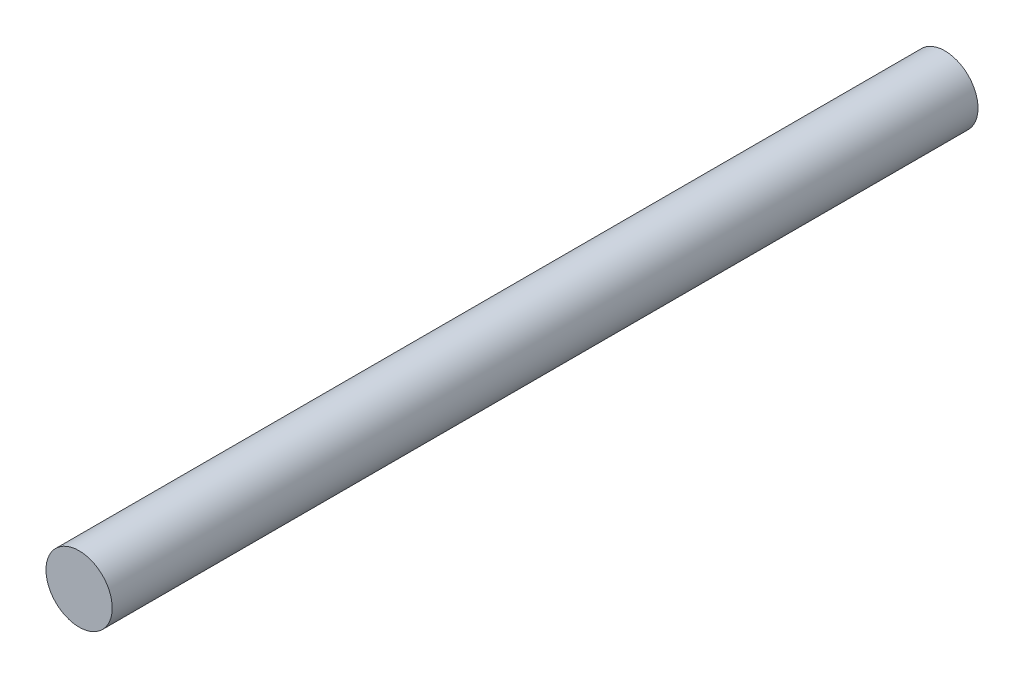
ISO-10303-21;
HEADER;
FILE_DESCRIPTION(('STEP AP214'),'2;1');
FILE_NAME('part.step','',(''),(''),'','','');
FILE_SCHEMA(('AUTOMOTIVE_DESIGN { 1 0 10303 214 1 1 1 1 }'));
ENDSEC;
DATA;
#1=APPLICATION_CONTEXT('core data for automotive mechanical design processes');
#2=APPLICATION_PROTOCOL_DEFINITION('international standard','automotive_design',2000,#1);
#3=PRODUCT_CONTEXT('',#1,'mechanical');
#4=PRODUCT('Part','Part','',(#3));
#5=PRODUCT_RELATED_PRODUCT_CATEGORY('part','',(#4));
#6=PRODUCT_DEFINITION_FORMATION('','',#4);
#7=PRODUCT_DEFINITION_CONTEXT('part definition',#1,'design');
#8=PRODUCT_DEFINITION('design','',#6,#7);
#9=PRODUCT_DEFINITION_SHAPE('','',#8);
#10=(LENGTH_UNIT() NAMED_UNIT(*) SI_UNIT(.MILLI.,.METRE.));
#11=(NAMED_UNIT(*) PLANE_ANGLE_UNIT() SI_UNIT($,.RADIAN.));
#12=(NAMED_UNIT(*) SI_UNIT($,.STERADIAN.) SOLID_ANGLE_UNIT());
#13=UNCERTAINTY_MEASURE_WITH_UNIT(LENGTH_MEASURE(1.E-05),#10,'distance_accuracy_value','');
#14=(GEOMETRIC_REPRESENTATION_CONTEXT(3) GLOBAL_UNCERTAINTY_ASSIGNED_CONTEXT((#13)) GLOBAL_UNIT_ASSIGNED_CONTEXT((#10,
#11,#12)) REPRESENTATION_CONTEXT('',''));
#15=CARTESIAN_POINT('',(0.,0.,0.));
#16=DIRECTION('',(0.,0.,1.));
#17=DIRECTION('',(1.,0.,0.));
#18=AXIS2_PLACEMENT_3D('',#15,#16,#17);
#19=CARTESIAN_POINT('',(-300.000000000001,667.332012286223,-369.357743681072));
#20=DIRECTION('',(0.,0.,1.));
#21=DIRECTION('',(1.,0.,0.));
#22=AXIS2_PLACEMENT_3D('',#19,#20,#21);
#23=PLANE('',#22);
#24=CARTESIAN_POINT('',(-300.000000000001,667.332012286223,-369.357743681072));
#25=DIRECTION('',(0.,0.,-1.));
#26=DIRECTION('',(0.,1.,0.));
#27=AXIS2_PLACEMENT_3D('',#24,#25,#26);
#28=CIRCLE('',#27,1.5875);
#29=CARTESIAN_POINT('',(-300.000000000001,668.919512286223,-369.357743681072));
#30=VERTEX_POINT('',#29);
#31=EDGE_CURVE('E18',#30,#30,#28,.T.);
#32=ORIENTED_EDGE('',*,*,#31,.F.);
#33=EDGE_LOOP('',(#32));
#34=FACE_BOUND('',#33,.T.);
#35=ADVANCED_FACE('F15',(#34),#23,.T.);
#36=CARTESIAN_POINT('',(-300.000000000001,667.332012286223,-410.857743681072));
#37=DIRECTION('',(0.,0.,-1.));
#38=DIRECTION('',(-1.,0.,0.));
#39=AXIS2_PLACEMENT_3D('',#36,#37,#38);
#40=PLANE('',#39);
#41=CARTESIAN_POINT('',(-300.000000000001,667.332012286223,-410.857743681072));
#42=DIRECTION('',(0.,0.,-1.));
#43=DIRECTION('',(0.,1.,0.));
#44=AXIS2_PLACEMENT_3D('',#41,#42,#43);
#45=CIRCLE('',#44,1.5875);
#46=CARTESIAN_POINT('',(-300.000000000001,668.919512286223,-410.857743681072));
#47=VERTEX_POINT('',#46);
#48=EDGE_CURVE('E10',#47,#47,#45,.F.);
#49=ORIENTED_EDGE('',*,*,#48,.F.);
#50=EDGE_LOOP('',(#49));
#51=FACE_BOUND('',#50,.T.);
#52=ADVANCED_FACE('F30',(#51),#40,.T.);
#53=CARTESIAN_POINT('',(-300.000000000001,667.332012286223,-390.107743681072));
#54=DIRECTION('',(0.,0.,-1.));
#55=DIRECTION('',(0.,1.,0.));
#56=AXIS2_PLACEMENT_3D('',#53,#54,#55);
#57=CYLINDRICAL_SURFACE('',#56,1.5875);
#58=ORIENTED_EDGE('',*,*,#31,.T.);
#59=EDGE_LOOP('',(#58));
#60=FACE_BOUND('',#59,.T.);
#61=ORIENTED_EDGE('',*,*,#48,.T.);
#62=EDGE_LOOP('',(#61));
#63=FACE_BOUND('',#62,.T.);
#64=ADVANCED_FACE('F27',(#60,#63),#57,.T.);
#65=CLOSED_SHELL('',(#35,#52,#64));
#66=MANIFOLD_SOLID_BREP('B1',#65);
#67=ADVANCED_BREP_SHAPE_REPRESENTATION('',(#18,#66),#14);
#68=SHAPE_DEFINITION_REPRESENTATION(#9,#67);
ENDSEC;
END-ISO-10303-21;
